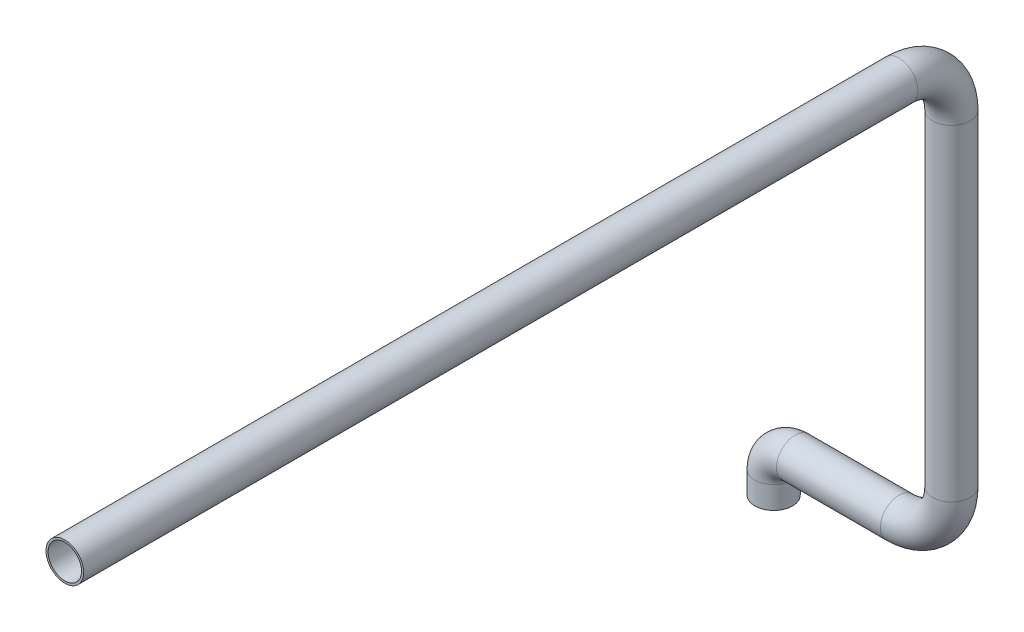
ISO-10303-21;
HEADER;
FILE_DESCRIPTION(('STEP AP214'),'2;1');
FILE_NAME('part.step','',(''),(''),'','','');
FILE_SCHEMA(('AUTOMOTIVE_DESIGN { 1 0 10303 214 1 1 1 1 }'));
ENDSEC;
DATA;
#1=APPLICATION_CONTEXT('core data for automotive mechanical design processes');
#2=APPLICATION_PROTOCOL_DEFINITION('international standard','automotive_design',2000,#1);
#3=PRODUCT_CONTEXT('',#1,'mechanical');
#4=PRODUCT('Part','Part','',(#3));
#5=PRODUCT_RELATED_PRODUCT_CATEGORY('part','',(#4));
#6=PRODUCT_DEFINITION_FORMATION('','',#4);
#7=PRODUCT_DEFINITION_CONTEXT('part definition',#1,'design');
#8=PRODUCT_DEFINITION('design','',#6,#7);
#9=PRODUCT_DEFINITION_SHAPE('','',#8);
#10=(LENGTH_UNIT() NAMED_UNIT(*) SI_UNIT(.MILLI.,.METRE.));
#11=(NAMED_UNIT(*) PLANE_ANGLE_UNIT() SI_UNIT($,.RADIAN.));
#12=(NAMED_UNIT(*) SI_UNIT($,.STERADIAN.) SOLID_ANGLE_UNIT());
#13=UNCERTAINTY_MEASURE_WITH_UNIT(LENGTH_MEASURE(1.E-05),#10,'distance_accuracy_value','');
#14=(GEOMETRIC_REPRESENTATION_CONTEXT(3) GLOBAL_UNCERTAINTY_ASSIGNED_CONTEXT((#13)) GLOBAL_UNIT_ASSIGNED_CONTEXT((#10,
#11,#12)) REPRESENTATION_CONTEXT('',''));
#15=CARTESIAN_POINT('',(0.,0.,0.));
#16=DIRECTION('',(0.,0.,1.));
#17=DIRECTION('',(1.,0.,0.));
#18=AXIS2_PLACEMENT_3D('',#15,#16,#17);
#19=CARTESIAN_POINT('',(85.,227.,424.));
#20=DIRECTION('',(0.,0.,-1.));
#21=DIRECTION('',(0.,1.,0.));
#22=AXIS2_PLACEMENT_3D('',#19,#20,#21);
#23=PLANE('',#22);
#24=CARTESIAN_POINT('',(85.,227.,424.));
#25=DIRECTION('',(0.,0.,-1.));
#26=DIRECTION('',(0.,1.,0.));
#27=AXIS2_PLACEMENT_3D('',#24,#25,#26);
#28=CIRCLE('',#27,7.99999999999999);
#29=CARTESIAN_POINT('',(85.,235.,424.));
#30=VERTEX_POINT('',#29);
#31=EDGE_CURVE('E286',#30,#30,#28,.T.);
#32=ORIENTED_EDGE('',*,*,#31,.T.);
#33=EDGE_LOOP('',(#32));
#34=FACE_BOUND('',#33,.T.);
#35=CARTESIAN_POINT('',(85.,227.,424.));
#36=DIRECTION('',(0.,0.,-1.));
#37=DIRECTION('',(0.,1.,0.));
#38=AXIS2_PLACEMENT_3D('',#35,#36,#37);
#39=CIRCLE('',#38,8.99999999999999);
#40=CARTESIAN_POINT('',(85.,236.,424.));
#41=VERTEX_POINT('',#40);
#42=EDGE_CURVE('E70',#41,#41,#39,.T.);
#43=ORIENTED_EDGE('',*,*,#42,.F.);
#44=EDGE_LOOP('',(#43));
#45=FACE_BOUND('',#44,.T.);
#46=ADVANCED_FACE('F67',(#34,#45),#23,.F.);
#47=CARTESIAN_POINT('',(0.,0.,0.));
#48=DIRECTION('',(0.,-1.,0.));
#49=DIRECTION('',(0.,0.,-1.));
#50=AXIS2_PLACEMENT_3D('',#47,#48,#49);
#51=PLANE('',#50);
#52=CARTESIAN_POINT('',(0.,0.,0.));
#53=DIRECTION('',(0.,-1.,0.));
#54=DIRECTION('',(0.,0.,-1.));
#55=AXIS2_PLACEMENT_3D('',#52,#53,#54);
#56=CIRCLE('',#55,7.99999999999999);
#57=CARTESIAN_POINT('',(0.,0.,-8.00000000000005));
#58=VERTEX_POINT('',#57);
#59=EDGE_CURVE('E300',#58,#58,#56,.T.);
#60=ORIENTED_EDGE('',*,*,#59,.F.);
#61=EDGE_LOOP('',(#60));
#62=FACE_BOUND('',#61,.T.);
#63=CARTESIAN_POINT('',(0.,0.,0.));
#64=DIRECTION('',(0.,-1.,0.));
#65=DIRECTION('',(0.,0.,-1.));
#66=AXIS2_PLACEMENT_3D('',#63,#64,#65);
#67=CIRCLE('',#66,8.99999999999999);
#68=CARTESIAN_POINT('',(0.,0.,-9.00000000000002));
#69=VERTEX_POINT('',#68);
#70=EDGE_CURVE('E84',#69,#69,#67,.T.);
#71=ORIENTED_EDGE('',*,*,#70,.T.);
#72=EDGE_LOOP('',(#71));
#73=FACE_BOUND('',#72,.T.);
#74=ADVANCED_FACE('F108',(#62,#73),#51,.T.);
#75=CARTESIAN_POINT('',(85.,227.,25.));
#76=DIRECTION('',(0.,0.,1.));
#77=DIRECTION('',(1.,0.,0.));
#78=AXIS2_PLACEMENT_3D('',#75,#76,#77);
#79=CYLINDRICAL_SURFACE('',#78,8.99999999999999);
#80=ORIENTED_EDGE('',*,*,#42,.T.);
#81=EDGE_LOOP('',(#80));
#82=FACE_BOUND('',#81,.T.);
#83=CARTESIAN_POINT('',(85.,227.,25.));
#84=DIRECTION('',(0.,6.42331442406598E-08,-0.999999999999998));
#85=DIRECTION('',(0.,0.999999999999998,6.42331442406598E-08));
#86=AXIS2_PLACEMENT_3D('',#83,#84,#85);
#87=CIRCLE('',#86,8.99999999999999);
#88=CARTESIAN_POINT('',(85.,236.,25.0000005780983));
#89=VERTEX_POINT('',#88);
#90=EDGE_CURVE('E95',#89,#89,#87,.T.);
#91=ORIENTED_EDGE('',*,*,#90,.F.);
#92=EDGE_LOOP('',(#91));
#93=FACE_BOUND('',#92,.T.);
#94=ADVANCED_FACE('F106',(#82,#93),#79,.T.);
#95=CARTESIAN_POINT('',(85.,46.,0.));
#96=DIRECTION('',(0.,1.,0.));
#97=DIRECTION('',(-1.,0.,0.));
#98=AXIS2_PLACEMENT_3D('',#95,#96,#97);
#99=CYLINDRICAL_SURFACE('',#98,8.99999999999999);
#100=CARTESIAN_POINT('',(85.,202.000001605828,0.));
#101=DIRECTION('',(0.,-1.,0.));
#102=DIRECTION('',(0.,0.,-1.));
#103=AXIS2_PLACEMENT_3D('',#100,#101,#102);
#104=CIRCLE('',#103,8.99999999999999);
#105=CARTESIAN_POINT('',(85.,202.000001605828,-9.00000000000002));
#106=VERTEX_POINT('',#105);
#107=EDGE_CURVE('E92',#106,#106,#104,.T.);
#108=ORIENTED_EDGE('',*,*,#107,.T.);
#109=EDGE_LOOP('',(#108));
#110=FACE_BOUND('',#109,.T.);
#111=CARTESIAN_POINT('',(85.,46.,0.));
#112=DIRECTION('',(6.42331451542213E-08,-0.999999999999998,0.));
#113=DIRECTION('',(0.,0.,-1.));
#114=AXIS2_PLACEMENT_3D('',#111,#112,#113);
#115=CIRCLE('',#114,8.99999999999999);
#116=CARTESIAN_POINT('',(94.,46.0000005780983,0.));
#117=VERTEX_POINT('',#116);
#118=EDGE_CURVE('E93',#117,#117,#115,.T.);
#119=ORIENTED_EDGE('',*,*,#118,.F.);
#120=EDGE_LOOP('',(#119));
#121=FACE_BOUND('',#120,.T.);
#122=ADVANCED_FACE('F107',(#110,#121),#99,.T.);
#123=CARTESIAN_POINT('',(85.,202.000001605829,24.9999983941715));
#124=DIRECTION('',(1.,0.,0.));
#125=DIRECTION('',(0.,0.,-1.));
#126=AXIS2_PLACEMENT_3D('',#123,#124,#125);
#127=TOROIDAL_SURFACE('',#126,24.9999983941715,8.99999999999999);
#128=CARTESIAN_POINT('',(85.,202.000001605829,24.9999983941715));
#129=DIRECTION('',(1.,0.,0.));
#130=DIRECTION('',(0.,0.,-1.));
#131=AXIS2_PLACEMENT_3D('',#128,#129,#130);
#132=CIRCLE('',#131,33.9999983941715);
#133=EDGE_CURVE('',#106,#89,#132,.T.);
#134=ORIENTED_EDGE('',*,*,#107,.F.);
#135=ORIENTED_EDGE('',*,*,#90,.T.);
#136=ORIENTED_EDGE('',*,*,#133,.T.);
#137=ORIENTED_EDGE('',*,*,#133,.F.);
#138=EDGE_LOOP('',(#134,#136,#135,#137));
#139=FACE_BOUND('',#138,.T.);
#140=ADVANCED_FACE('F103',(#139),#127,.T.);
#141=CARTESIAN_POINT('',(10.29,21.,0.));
#142=DIRECTION('',(1.,0.,0.));
#143=DIRECTION('',(0.,0.,-1.));
#144=AXIS2_PLACEMENT_3D('',#141,#142,#143);
#145=CYLINDRICAL_SURFACE('',#144,8.99999999999999);
#146=CARTESIAN_POINT('',(60.0000016058285,21.,0.));
#147=DIRECTION('',(-1.,0.,0.));
#148=DIRECTION('',(0.,0.,-1.));
#149=AXIS2_PLACEMENT_3D('',#146,#147,#148);
#150=CIRCLE('',#149,8.99999999999999);
#151=CARTESIAN_POINT('',(60.0000016058285,12.,0.));
#152=VERTEX_POINT('',#151);
#153=EDGE_CURVE('E87',#152,#152,#150,.T.);
#154=ORIENTED_EDGE('',*,*,#153,.T.);
#155=EDGE_LOOP('',(#154));
#156=FACE_BOUND('',#155,.T.);
#157=CARTESIAN_POINT('',(10.2900000000001,21.,0.));
#158=DIRECTION('',(-0.999999999999997,7.35235201171097E-08,0.));
#159=DIRECTION('',(0.,0.,-1.));
#160=AXIS2_PLACEMENT_3D('',#157,#158,#159);
#161=CIRCLE('',#160,8.99999999999999);
#162=CARTESIAN_POINT('',(10.2900006617118,30.,0.));
#163=VERTEX_POINT('',#162);
#164=EDGE_CURVE('E11',#163,#163,#161,.T.);
#165=ORIENTED_EDGE('',*,*,#164,.F.);
#166=EDGE_LOOP('',(#165));
#167=FACE_BOUND('',#166,.T.);
#168=ADVANCED_FACE('F137',(#156,#167),#145,.T.);
#169=CARTESIAN_POINT('',(60.0000016058285,45.9999983941715,0.));
#170=DIRECTION('',(0.,0.,1.));
#171=DIRECTION('',(1.,0.,0.));
#172=AXIS2_PLACEMENT_3D('',#169,#170,#171);
#173=TOROIDAL_SURFACE('',#172,24.9999983941715,8.99999999999999);
#174=CARTESIAN_POINT('',(60.0000016058285,45.9999983941715,0.));
#175=DIRECTION('',(0.,0.,1.));
#176=DIRECTION('',(1.,0.,0.));
#177=AXIS2_PLACEMENT_3D('',#174,#175,#176);
#178=CIRCLE('',#177,33.9999983941715);
#179=EDGE_CURVE('',#152,#117,#178,.T.);
#180=ORIENTED_EDGE('',*,*,#153,.F.);
#181=ORIENTED_EDGE('',*,*,#118,.T.);
#182=ORIENTED_EDGE('',*,*,#179,.T.);
#183=ORIENTED_EDGE('',*,*,#179,.F.);
#184=EDGE_LOOP('',(#180,#182,#181,#183));
#185=FACE_BOUND('',#184,.T.);
#186=ADVANCED_FACE('F135',(#185),#173,.T.);
#187=CARTESIAN_POINT('',(0.,0.,0.));
#188=DIRECTION('',(0.,1.,0.));
#189=DIRECTION('',(0.,0.,1.));
#190=AXIS2_PLACEMENT_3D('',#187,#188,#189);
#191=CYLINDRICAL_SURFACE('',#190,8.99999999999999);
#192=CARTESIAN_POINT('',(0.,10.710000756557,0.));
#193=DIRECTION('',(0.,-1.,0.));
#194=DIRECTION('',(0.,0.,-1.));
#195=AXIS2_PLACEMENT_3D('',#192,#193,#194);
#196=CIRCLE('',#195,8.99999999999999);
#197=CARTESIAN_POINT('',(-9.00000000000001,10.7100007565571,0.));
#198=VERTEX_POINT('',#197);
#199=EDGE_CURVE('E73',#198,#198,#196,.T.);
#200=ORIENTED_EDGE('',*,*,#199,.T.);
#201=EDGE_LOOP('',(#200));
#202=FACE_BOUND('',#201,.T.);
#203=ORIENTED_EDGE('',*,*,#70,.F.);
#204=EDGE_LOOP('',(#203));
#205=FACE_BOUND('',#204,.T.);
#206=ADVANCED_FACE('F124',(#202,#205),#191,.T.);
#207=CARTESIAN_POINT('',(10.289999243443,10.710000756557,0.));
#208=DIRECTION('',(0.,0.,-1.));
#209=DIRECTION('',(-1.,0.,0.));
#210=AXIS2_PLACEMENT_3D('',#207,#208,#209);
#211=TOROIDAL_SURFACE('',#210,10.289999243443,8.99999999999999);
#212=CARTESIAN_POINT('',(10.289999243443,10.710000756557,0.));
#213=DIRECTION('',(0.,0.,-1.));
#214=DIRECTION('',(-1.,0.,0.));
#215=AXIS2_PLACEMENT_3D('',#212,#213,#214);
#216=CIRCLE('',#215,19.289999243443);
#217=EDGE_CURVE('',#198,#163,#216,.T.);
#218=ORIENTED_EDGE('',*,*,#199,.F.);
#219=ORIENTED_EDGE('',*,*,#164,.T.);
#220=ORIENTED_EDGE('',*,*,#217,.T.);
#221=ORIENTED_EDGE('',*,*,#217,.F.);
#222=EDGE_LOOP('',(#218,#220,#219,#221));
#223=FACE_BOUND('',#222,.T.);
#224=ADVANCED_FACE('F118',(#223),#211,.T.);
#225=CARTESIAN_POINT('',(0.,-1.,0.));
#226=DIRECTION('',(0.,1.,0.));
#227=DIRECTION('',(0.,0.,1.));
#228=AXIS2_PLACEMENT_3D('',#225,#226,#227);
#229=CYLINDRICAL_SURFACE('',#228,7.99999999999999);
#230=CARTESIAN_POINT('',(0.,10.710000756557,0.));
#231=DIRECTION('',(0.,-1.,0.));
#232=DIRECTION('',(0.,0.,-1.));
#233=AXIS2_PLACEMENT_3D('',#230,#231,#232);
#234=CIRCLE('',#233,7.99999999999999);
#235=CARTESIAN_POINT('',(-8.,10.7100007565571,0.));
#236=VERTEX_POINT('',#235);
#237=EDGE_CURVE('E281',#236,#236,#234,.T.);
#238=ORIENTED_EDGE('',*,*,#237,.F.);
#239=EDGE_LOOP('',(#238));
#240=FACE_BOUND('',#239,.T.);
#241=ORIENTED_EDGE('',*,*,#59,.T.);
#242=EDGE_LOOP('',(#241));
#243=FACE_BOUND('',#242,.T.);
#244=ADVANCED_FACE('F122',(#240,#243),#229,.F.);
#245=CARTESIAN_POINT('',(85.,227.,25.));
#246=DIRECTION('',(0.,0.,1.));
#247=DIRECTION('',(1.,0.,0.));
#248=AXIS2_PLACEMENT_3D('',#245,#246,#247);
#249=CYLINDRICAL_SURFACE('',#248,7.99999999999999);
#250=ORIENTED_EDGE('',*,*,#31,.F.);
#251=EDGE_LOOP('',(#250));
#252=FACE_BOUND('',#251,.T.);
#253=CARTESIAN_POINT('',(85.,227.,25.));
#254=DIRECTION('',(0.,6.42331442406598E-08,-0.999999999999998));
#255=DIRECTION('',(0.,0.999999999999998,6.42331442406598E-08));
#256=AXIS2_PLACEMENT_3D('',#253,#254,#255);
#257=CIRCLE('',#256,7.99999999999999);
#258=CARTESIAN_POINT('',(85.,235.,25.0000005138651));
#259=VERTEX_POINT('',#258);
#260=EDGE_CURVE('E308',#259,#259,#257,.T.);
#261=ORIENTED_EDGE('',*,*,#260,.T.);
#262=EDGE_LOOP('',(#261));
#263=FACE_BOUND('',#262,.T.);
#264=ADVANCED_FACE('F126',(#252,#263),#249,.F.);
#265=CARTESIAN_POINT('',(85.,46.,0.));
#266=DIRECTION('',(0.,1.,0.));
#267=DIRECTION('',(-1.,0.,0.));
#268=AXIS2_PLACEMENT_3D('',#265,#266,#267);
#269=CYLINDRICAL_SURFACE('',#268,7.99999999999999);
#270=CARTESIAN_POINT('',(85.,202.000001605828,0.));
#271=DIRECTION('',(0.,-1.,0.));
#272=DIRECTION('',(0.,0.,-1.));
#273=AXIS2_PLACEMENT_3D('',#270,#271,#272);
#274=CIRCLE('',#273,7.99999999999999);
#275=CARTESIAN_POINT('',(85.,202.000001605828,-8.00000000000008));
#276=VERTEX_POINT('',#275);
#277=EDGE_CURVE('E295',#276,#276,#274,.T.);
#278=ORIENTED_EDGE('',*,*,#277,.F.);
#279=EDGE_LOOP('',(#278));
#280=FACE_BOUND('',#279,.T.);
#281=CARTESIAN_POINT('',(85.,46.,0.));
#282=DIRECTION('',(6.42331451542213E-08,-0.999999999999998,0.));
#283=DIRECTION('',(0.,0.,-1.));
#284=AXIS2_PLACEMENT_3D('',#281,#282,#283);
#285=CIRCLE('',#284,7.99999999999999);
#286=CARTESIAN_POINT('',(93.,46.0000005138651,0.));
#287=VERTEX_POINT('',#286);
#288=EDGE_CURVE('E305',#287,#287,#285,.T.);
#289=ORIENTED_EDGE('',*,*,#288,.T.);
#290=EDGE_LOOP('',(#289));
#291=FACE_BOUND('',#290,.T.);
#292=ADVANCED_FACE('F191',(#280,#291),#269,.F.);
#293=CARTESIAN_POINT('',(85.,202.000001605829,24.9999983941715));
#294=DIRECTION('',(1.,0.,0.));
#295=DIRECTION('',(0.,0.,-1.));
#296=AXIS2_PLACEMENT_3D('',#293,#294,#295);
#297=TOROIDAL_SURFACE('',#296,24.9999983941716,7.99999999999999);
#298=CARTESIAN_POINT('',(85.,202.000001605829,24.9999983941715));
#299=DIRECTION('',(1.,0.,0.));
#300=DIRECTION('',(0.,0.,-1.));
#301=AXIS2_PLACEMENT_3D('',#298,#299,#300);
#302=CIRCLE('',#301,32.9999983941716);
#303=EDGE_CURVE('',#276,#259,#302,.T.);
#304=ORIENTED_EDGE('',*,*,#277,.T.);
#305=ORIENTED_EDGE('',*,*,#260,.F.);
#306=ORIENTED_EDGE('',*,*,#303,.T.);
#307=ORIENTED_EDGE('',*,*,#303,.F.);
#308=EDGE_LOOP('',(#304,#306,#305,#307));
#309=FACE_BOUND('',#308,.T.);
#310=ADVANCED_FACE('F203',(#309),#297,.F.);
#311=CARTESIAN_POINT('',(10.29,21.,0.));
#312=DIRECTION('',(1.,0.,0.));
#313=DIRECTION('',(0.,0.,-1.));
#314=AXIS2_PLACEMENT_3D('',#311,#312,#313);
#315=CYLINDRICAL_SURFACE('',#314,7.99999999999999);
#316=CARTESIAN_POINT('',(60.0000016058285,21.,0.));
#317=DIRECTION('',(-1.,0.,0.));
#318=DIRECTION('',(0.,0.,-1.));
#319=AXIS2_PLACEMENT_3D('',#316,#317,#318);
#320=CIRCLE('',#319,7.99999999999999);
#321=CARTESIAN_POINT('',(60.0000016058285,13.,0.));
#322=VERTEX_POINT('',#321);
#323=EDGE_CURVE('E304',#322,#322,#320,.T.);
#324=ORIENTED_EDGE('',*,*,#323,.F.);
#325=EDGE_LOOP('',(#324));
#326=FACE_BOUND('',#325,.T.);
#327=CARTESIAN_POINT('',(10.2900000000001,21.,0.));
#328=DIRECTION('',(-0.999999999999997,7.35235201171097E-08,0.));
#329=DIRECTION('',(0.,0.,-1.));
#330=AXIS2_PLACEMENT_3D('',#327,#328,#329);
#331=CIRCLE('',#330,7.99999999999999);
#332=CARTESIAN_POINT('',(10.2900005881883,29.,0.));
#333=VERTEX_POINT('',#332);
#334=EDGE_CURVE('E282',#333,#333,#331,.T.);
#335=ORIENTED_EDGE('',*,*,#334,.T.);
#336=EDGE_LOOP('',(#335));
#337=FACE_BOUND('',#336,.T.);
#338=ADVANCED_FACE('F211',(#326,#337),#315,.F.);
#339=CARTESIAN_POINT('',(60.0000016058285,45.9999983941715,0.));
#340=DIRECTION('',(0.,0.,1.));
#341=DIRECTION('',(1.,0.,0.));
#342=AXIS2_PLACEMENT_3D('',#339,#340,#341);
#343=TOROIDAL_SURFACE('',#342,24.9999983941715,7.99999999999999);
#344=CARTESIAN_POINT('',(60.0000016058285,45.9999983941715,0.));
#345=DIRECTION('',(0.,0.,1.));
#346=DIRECTION('',(1.,0.,0.));
#347=AXIS2_PLACEMENT_3D('',#344,#345,#346);
#348=CIRCLE('',#347,32.9999983941715);
#349=EDGE_CURVE('',#322,#287,#348,.T.);
#350=ORIENTED_EDGE('',*,*,#323,.T.);
#351=ORIENTED_EDGE('',*,*,#288,.F.);
#352=ORIENTED_EDGE('',*,*,#349,.T.);
#353=ORIENTED_EDGE('',*,*,#349,.F.);
#354=EDGE_LOOP('',(#350,#352,#351,#353));
#355=FACE_BOUND('',#354,.T.);
#356=ADVANCED_FACE('F222',(#355),#343,.F.);
#357=CARTESIAN_POINT('',(10.289999243443,10.710000756557,0.));
#358=DIRECTION('',(0.,0.,-1.));
#359=DIRECTION('',(-1.,0.,0.));
#360=AXIS2_PLACEMENT_3D('',#357,#358,#359);
#361=TOROIDAL_SURFACE('',#360,10.289999243443,7.99999999999999);
#362=CARTESIAN_POINT('',(10.289999243443,10.710000756557,0.));
#363=DIRECTION('',(0.,0.,-1.));
#364=DIRECTION('',(-1.,0.,0.));
#365=AXIS2_PLACEMENT_3D('',#362,#363,#364);
#366=CIRCLE('',#365,18.289999243443);
#367=EDGE_CURVE('',#236,#333,#366,.T.);
#368=ORIENTED_EDGE('',*,*,#237,.T.);
#369=ORIENTED_EDGE('',*,*,#334,.F.);
#370=ORIENTED_EDGE('',*,*,#367,.T.);
#371=ORIENTED_EDGE('',*,*,#367,.F.);
#372=EDGE_LOOP('',(#368,#370,#369,#371));
#373=FACE_BOUND('',#372,.T.);
#374=ADVANCED_FACE('F132',(#373),#361,.F.);
#375=CLOSED_SHELL('',(#46,#74,#94,#122,#140,#168,#186,#206,#224,#244,#264,#292,#310,#338,#356,#374));
#376=MANIFOLD_SOLID_BREP('B2',#375);
#377=ADVANCED_BREP_SHAPE_REPRESENTATION('',(#18,#376),#14);
#378=SHAPE_DEFINITION_REPRESENTATION(#9,#377);
ENDSEC;
END-ISO-10303-21;
